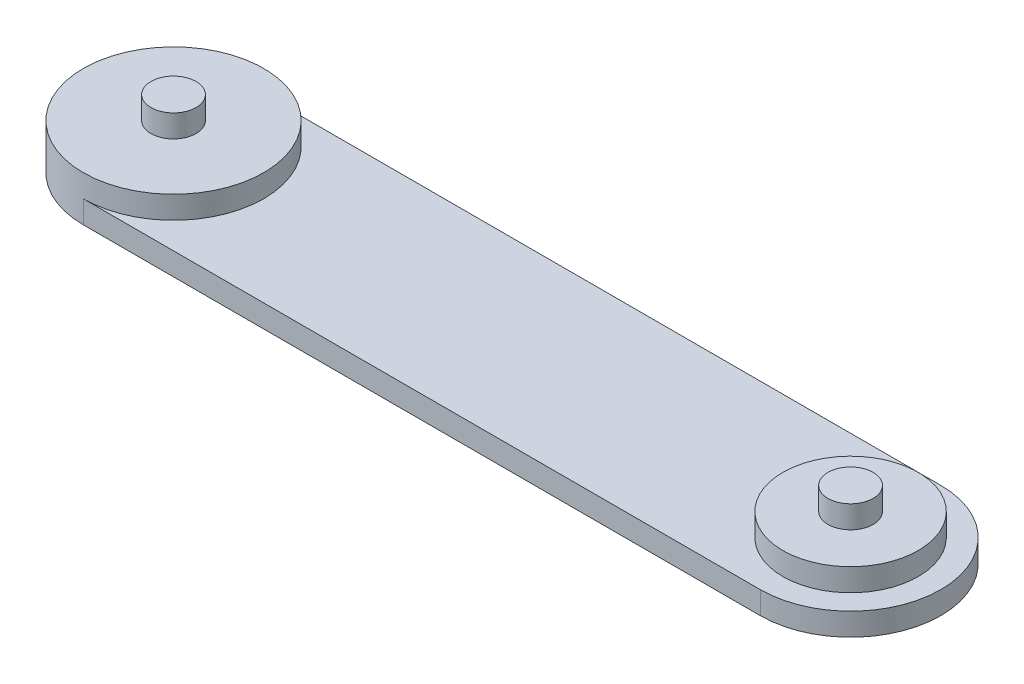
ISO-10303-21;
HEADER;
FILE_DESCRIPTION(('STEP AP214'),'2;1');
FILE_NAME('part.step','',(''),(''),'','','');
FILE_SCHEMA(('AUTOMOTIVE_DESIGN { 1 0 10303 214 1 1 1 1 }'));
ENDSEC;
DATA;
#1=APPLICATION_CONTEXT('core data for automotive mechanical design processes');
#2=APPLICATION_PROTOCOL_DEFINITION('international standard','automotive_design',2000,#1);
#3=PRODUCT_CONTEXT('',#1,'mechanical');
#4=PRODUCT('Part','Part','',(#3));
#5=PRODUCT_RELATED_PRODUCT_CATEGORY('part','',(#4));
#6=PRODUCT_DEFINITION_FORMATION('','',#4);
#7=PRODUCT_DEFINITION_CONTEXT('part definition',#1,'design');
#8=PRODUCT_DEFINITION('design','',#6,#7);
#9=PRODUCT_DEFINITION_SHAPE('','',#8);
#10=(LENGTH_UNIT() NAMED_UNIT(*) SI_UNIT(.MILLI.,.METRE.));
#11=(NAMED_UNIT(*) PLANE_ANGLE_UNIT() SI_UNIT($,.RADIAN.));
#12=(NAMED_UNIT(*) SI_UNIT($,.STERADIAN.) SOLID_ANGLE_UNIT());
#13=UNCERTAINTY_MEASURE_WITH_UNIT(LENGTH_MEASURE(1.E-05),#10,'distance_accuracy_value','');
#14=(GEOMETRIC_REPRESENTATION_CONTEXT(3) GLOBAL_UNCERTAINTY_ASSIGNED_CONTEXT((#13)) GLOBAL_UNIT_ASSIGNED_CONTEXT((#10,
#11,#12)) REPRESENTATION_CONTEXT('',''));
#15=CARTESIAN_POINT('',(0.,0.,0.));
#16=DIRECTION('',(0.,0.,1.));
#17=DIRECTION('',(1.,0.,0.));
#18=AXIS2_PLACEMENT_3D('',#15,#16,#17);
#19=CARTESIAN_POINT('',(-300.,10.,0.));
#20=DIRECTION('',(0.,-1.,0.));
#21=DIRECTION('',(0.,0.,-1.));
#22=AXIS2_PLACEMENT_3D('',#19,#20,#21);
#23=CYLINDRICAL_SURFACE('',#22,40.);
#24=CARTESIAN_POINT('',(-300.,0.,0.));
#25=DIRECTION('',(0.,1.,0.));
#26=DIRECTION('',(0.,0.,1.));
#27=AXIS2_PLACEMENT_3D('',#24,#25,#26);
#28=CIRCLE('',#27,40.);
#29=CARTESIAN_POINT('',(-300.,0.,-40.));
#30=VERTEX_POINT('',#29);
#31=CARTESIAN_POINT('',(-300.,0.,40.));
#32=VERTEX_POINT('',#31);
#33=EDGE_CURVE('E192',#30,#32,#28,.T.);
#34=ORIENTED_EDGE('',*,*,#33,.T.);
#35=DIRECTION('',(0.,-1.,0.));
#36=VECTOR('',#35,1.);
#37=CARTESIAN_POINT('',(-300.,10.,40.));
#38=LINE('',#37,#36);
#39=CARTESIAN_POINT('',(-300.,10.,40.));
#40=VERTEX_POINT('',#39);
#41=EDGE_CURVE('E45',#40,#32,#38,.T.);
#42=ORIENTED_EDGE('',*,*,#41,.F.);
#43=CARTESIAN_POINT('',(-300.,10.,0.));
#44=DIRECTION('',(0.,1.,0.));
#45=DIRECTION('',(0.,0.,1.));
#46=AXIS2_PLACEMENT_3D('',#43,#44,#45);
#47=CIRCLE('',#46,40.);
#48=CARTESIAN_POINT('',(-300.,10.,-40.));
#49=VERTEX_POINT('',#48);
#50=EDGE_CURVE('E184',#40,#49,#47,.T.);
#51=ORIENTED_EDGE('',*,*,#50,.T.);
#52=DIRECTION('',(0.,-1.,0.));
#53=VECTOR('',#52,1.);
#54=CARTESIAN_POINT('',(-300.,10.,-40.));
#55=LINE('',#54,#53);
#56=EDGE_CURVE('E203',#49,#30,#55,.T.);
#57=ORIENTED_EDGE('',*,*,#56,.T.);
#58=EDGE_LOOP('',(#34,#42,#51,#57));
#59=FACE_BOUND('',#58,.T.);
#60=CARTESIAN_POINT('',(-300.,20.,0.));
#61=DIRECTION('',(0.,1.,0.));
#62=DIRECTION('',(0.,0.,1.));
#63=AXIS2_PLACEMENT_3D('',#60,#61,#62);
#64=CIRCLE('',#63,40.);
#65=CARTESIAN_POINT('',(-300.,20.,40.));
#66=VERTEX_POINT('',#65);
#67=EDGE_CURVE('E188',#66,#66,#64,.T.);
#68=ORIENTED_EDGE('',*,*,#67,.F.);
#69=EDGE_LOOP('',(#68));
#70=FACE_BOUND('',#69,.T.);
#71=ADVANCED_FACE('F42',(#59,#70),#23,.T.);
#72=CARTESIAN_POINT('',(-300.,10.,40.));
#73=DIRECTION('',(0.,0.,-1.));
#74=DIRECTION('',(-1.,0.,0.));
#75=AXIS2_PLACEMENT_3D('',#72,#73,#74);
#76=PLANE('',#75);
#77=DIRECTION('',(1.,0.,0.));
#78=VECTOR('',#77,1.);
#79=CARTESIAN_POINT('',(-300.,0.,40.));
#80=LINE('',#79,#78);
#81=CARTESIAN_POINT('',(0.,0.,40.));
#82=VERTEX_POINT('',#81);
#83=EDGE_CURVE('E207',#32,#82,#80,.T.);
#84=ORIENTED_EDGE('',*,*,#83,.T.);
#85=DIRECTION('',(0.,-1.,0.));
#86=VECTOR('',#85,1.);
#87=CARTESIAN_POINT('',(0.,10.,40.));
#88=LINE('',#87,#86);
#89=CARTESIAN_POINT('',(0.,10.,40.));
#90=VERTEX_POINT('',#89);
#91=EDGE_CURVE('E219',#90,#82,#88,.T.);
#92=ORIENTED_EDGE('',*,*,#91,.F.);
#93=DIRECTION('',(1.,0.,0.));
#94=VECTOR('',#93,1.);
#95=CARTESIAN_POINT('',(-300.,10.,40.));
#96=LINE('',#95,#94);
#97=EDGE_CURVE('E92',#40,#90,#96,.T.);
#98=ORIENTED_EDGE('',*,*,#97,.F.);
#99=ORIENTED_EDGE('',*,*,#41,.T.);
#100=EDGE_LOOP('',(#84,#92,#98,#99));
#101=FACE_BOUND('',#100,.T.);
#102=ADVANCED_FACE('F228',(#101),#76,.F.);
#103=CARTESIAN_POINT('',(0.,10.,0.));
#104=DIRECTION('',(0.,-1.,0.));
#105=DIRECTION('',(0.,0.,-1.));
#106=AXIS2_PLACEMENT_3D('',#103,#104,#105);
#107=CYLINDRICAL_SURFACE('',#106,40.);
#108=CARTESIAN_POINT('',(0.,0.,0.));
#109=DIRECTION('',(0.,1.,0.));
#110=DIRECTION('',(0.,0.,1.));
#111=AXIS2_PLACEMENT_3D('',#108,#109,#110);
#112=CIRCLE('',#111,40.);
#113=CARTESIAN_POINT('',(0.,0.,-40.));
#114=VERTEX_POINT('',#113);
#115=EDGE_CURVE('E210',#82,#114,#112,.T.);
#116=ORIENTED_EDGE('',*,*,#115,.T.);
#117=DIRECTION('',(0.,-1.,0.));
#118=VECTOR('',#117,1.);
#119=CARTESIAN_POINT('',(0.,10.,-40.));
#120=LINE('',#119,#118);
#121=CARTESIAN_POINT('',(0.,10.,-40.));
#122=VERTEX_POINT('',#121);
#123=EDGE_CURVE('E217',#122,#114,#120,.T.);
#124=ORIENTED_EDGE('',*,*,#123,.F.);
#125=CARTESIAN_POINT('',(0.,10.,0.));
#126=DIRECTION('',(0.,1.,0.));
#127=DIRECTION('',(0.,0.,1.));
#128=AXIS2_PLACEMENT_3D('',#125,#126,#127);
#129=CIRCLE('',#128,40.);
#130=EDGE_CURVE('E198',#90,#122,#129,.T.);
#131=ORIENTED_EDGE('',*,*,#130,.F.);
#132=ORIENTED_EDGE('',*,*,#91,.T.);
#133=EDGE_LOOP('',(#116,#124,#131,#132));
#134=FACE_BOUND('',#133,.T.);
#135=ADVANCED_FACE('F235',(#134),#107,.T.);
#136=CARTESIAN_POINT('',(-300.,10.,-40.));
#137=DIRECTION('',(0.,0.,1.));
#138=DIRECTION('',(1.,0.,0.));
#139=AXIS2_PLACEMENT_3D('',#136,#137,#138);
#140=PLANE('',#139);
#141=DIRECTION('',(-1.,0.,0.));
#142=VECTOR('',#141,1.);
#143=CARTESIAN_POINT('',(-300.,0.,-40.));
#144=LINE('',#143,#142);
#145=EDGE_CURVE('E88',#114,#30,#144,.T.);
#146=ORIENTED_EDGE('',*,*,#145,.T.);
#147=ORIENTED_EDGE('',*,*,#56,.F.);
#148=DIRECTION('',(-1.,0.,0.));
#149=VECTOR('',#148,1.);
#150=CARTESIAN_POINT('',(-300.,10.,-40.));
#151=LINE('',#150,#149);
#152=EDGE_CURVE('E68',#122,#49,#151,.T.);
#153=ORIENTED_EDGE('',*,*,#152,.F.);
#154=ORIENTED_EDGE('',*,*,#123,.T.);
#155=EDGE_LOOP('',(#146,#147,#153,#154));
#156=FACE_BOUND('',#155,.T.);
#157=ADVANCED_FACE('F236',(#156),#140,.F.);
#158=CARTESIAN_POINT('',(-300.,10.,0.));
#159=DIRECTION('',(0.,1.,0.));
#160=DIRECTION('',(0.,0.,1.));
#161=AXIS2_PLACEMENT_3D('',#158,#159,#160);
#162=PLANE('',#161);
#163=CARTESIAN_POINT('',(0.,10.,0.));
#164=DIRECTION('',(0.,1.,0.));
#165=DIRECTION('',(0.,0.,1.));
#166=AXIS2_PLACEMENT_3D('',#163,#164,#165);
#167=CIRCLE('',#166,30.);
#168=CARTESIAN_POINT('',(0.,10.,30.));
#169=VERTEX_POINT('',#168);
#170=EDGE_CURVE('E180',#169,#169,#167,.T.);
#171=ORIENTED_EDGE('',*,*,#170,.F.);
#172=EDGE_LOOP('',(#171));
#173=FACE_BOUND('',#172,.T.);
#174=ORIENTED_EDGE('',*,*,#50,.F.);
#175=ORIENTED_EDGE('',*,*,#97,.T.);
#176=ORIENTED_EDGE('',*,*,#130,.T.);
#177=ORIENTED_EDGE('',*,*,#152,.T.);
#178=EDGE_LOOP('',(#174,#175,#176,#177));
#179=FACE_BOUND('',#178,.T.);
#180=ADVANCED_FACE('F237',(#173,#179),#162,.T.);
#181=CARTESIAN_POINT('',(-300.,0.,0.));
#182=DIRECTION('',(0.,1.,0.));
#183=DIRECTION('',(0.,0.,1.));
#184=AXIS2_PLACEMENT_3D('',#181,#182,#183);
#185=PLANE('',#184);
#186=DIRECTION('',(1.,0.,0.));
#187=VECTOR('',#186,1.);
#188=CARTESIAN_POINT('',(-300.,0.,-25.));
#189=LINE('',#188,#187);
#190=CARTESIAN_POINT('',(-300.,0.,-25.));
#191=VERTEX_POINT('',#190);
#192=CARTESIAN_POINT('',(0.,0.,-25.));
#193=VERTEX_POINT('',#192);
#194=EDGE_CURVE('E154',#191,#193,#189,.T.);
#195=ORIENTED_EDGE('',*,*,#194,.F.);
#196=CARTESIAN_POINT('',(-300.,0.,0.));
#197=DIRECTION('',(0.,-1.,0.));
#198=DIRECTION('',(0.,0.,-1.));
#199=AXIS2_PLACEMENT_3D('',#196,#197,#198);
#200=CIRCLE('',#199,25.);
#201=CARTESIAN_POINT('',(-300.,0.,25.));
#202=VERTEX_POINT('',#201);
#203=EDGE_CURVE('E59',#202,#191,#200,.T.);
#204=ORIENTED_EDGE('',*,*,#203,.F.);
#205=DIRECTION('',(-1.,0.,0.));
#206=VECTOR('',#205,1.);
#207=CARTESIAN_POINT('',(-300.,0.,25.));
#208=LINE('',#207,#206);
#209=CARTESIAN_POINT('',(0.,0.,25.));
#210=VERTEX_POINT('',#209);
#211=EDGE_CURVE('E141',#210,#202,#208,.T.);
#212=ORIENTED_EDGE('',*,*,#211,.F.);
#213=CARTESIAN_POINT('',(0.,0.,0.));
#214=DIRECTION('',(0.,-1.,0.));
#215=DIRECTION('',(0.,0.,-1.));
#216=AXIS2_PLACEMENT_3D('',#213,#214,#215);
#217=CIRCLE('',#216,25.);
#218=EDGE_CURVE('E145',#193,#210,#217,.T.);
#219=ORIENTED_EDGE('',*,*,#218,.F.);
#220=EDGE_LOOP('',(#195,#204,#212,#219));
#221=FACE_BOUND('',#220,.T.);
#222=ORIENTED_EDGE('',*,*,#33,.F.);
#223=ORIENTED_EDGE('',*,*,#145,.F.);
#224=ORIENTED_EDGE('',*,*,#115,.F.);
#225=ORIENTED_EDGE('',*,*,#83,.F.);
#226=EDGE_LOOP('',(#222,#223,#224,#225));
#227=FACE_BOUND('',#226,.T.);
#228=ADVANCED_FACE('F233',(#221,#227),#185,.F.);
#229=CARTESIAN_POINT('',(-300.,20.,0.));
#230=DIRECTION('',(0.,1.,0.));
#231=DIRECTION('',(0.,0.,1.));
#232=AXIS2_PLACEMENT_3D('',#229,#230,#231);
#233=PLANE('',#232);
#234=CARTESIAN_POINT('',(-300.,20.,0.));
#235=DIRECTION('',(0.,1.,0.));
#236=DIRECTION('',(0.,0.,1.));
#237=AXIS2_PLACEMENT_3D('',#234,#235,#236);
#238=CIRCLE('',#237,10.);
#239=CARTESIAN_POINT('',(-300.,20.,10.));
#240=VERTEX_POINT('',#239);
#241=EDGE_CURVE('E11',#240,#240,#238,.T.);
#242=ORIENTED_EDGE('',*,*,#241,.F.);
#243=EDGE_LOOP('',(#242));
#244=FACE_BOUND('',#243,.T.);
#245=ORIENTED_EDGE('',*,*,#67,.T.);
#246=EDGE_LOOP('',(#245));
#247=FACE_BOUND('',#246,.T.);
#248=ADVANCED_FACE('F246',(#244,#247),#233,.T.);
#249=CARTESIAN_POINT('',(0.,20.,0.));
#250=DIRECTION('',(0.,-1.,0.));
#251=DIRECTION('',(0.,0.,-1.));
#252=AXIS2_PLACEMENT_3D('',#249,#250,#251);
#253=CYLINDRICAL_SURFACE('',#252,30.);
#254=CARTESIAN_POINT('',(0.,20.,0.));
#255=DIRECTION('',(0.,1.,0.));
#256=DIRECTION('',(0.,0.,1.));
#257=AXIS2_PLACEMENT_3D('',#254,#255,#256);
#258=CIRCLE('',#257,30.);
#259=CARTESIAN_POINT('',(0.,20.,30.));
#260=VERTEX_POINT('',#259);
#261=EDGE_CURVE('E176',#260,#260,#258,.T.);
#262=ORIENTED_EDGE('',*,*,#261,.F.);
#263=EDGE_LOOP('',(#262));
#264=FACE_BOUND('',#263,.T.);
#265=ORIENTED_EDGE('',*,*,#170,.T.);
#266=EDGE_LOOP('',(#265));
#267=FACE_BOUND('',#266,.T.);
#268=ADVANCED_FACE('F280',(#264,#267),#253,.T.);
#269=CARTESIAN_POINT('',(0.,20.,0.));
#270=DIRECTION('',(0.,1.,0.));
#271=DIRECTION('',(0.,0.,1.));
#272=AXIS2_PLACEMENT_3D('',#269,#270,#271);
#273=PLANE('',#272);
#274=CARTESIAN_POINT('',(0.,20.,0.));
#275=DIRECTION('',(0.,1.,0.));
#276=DIRECTION('',(0.,0.,1.));
#277=AXIS2_PLACEMENT_3D('',#274,#275,#276);
#278=CIRCLE('',#277,10.);
#279=CARTESIAN_POINT('',(0.,20.,10.));
#280=VERTEX_POINT('',#279);
#281=EDGE_CURVE('E51',#280,#280,#278,.T.);
#282=ORIENTED_EDGE('',*,*,#281,.F.);
#283=EDGE_LOOP('',(#282));
#284=FACE_BOUND('',#283,.T.);
#285=ORIENTED_EDGE('',*,*,#261,.T.);
#286=EDGE_LOOP('',(#285));
#287=FACE_BOUND('',#286,.T.);
#288=ADVANCED_FACE('F285',(#284,#287),#273,.T.);
#289=CARTESIAN_POINT('',(0.,30.,0.));
#290=DIRECTION('',(0.,-1.,0.));
#291=DIRECTION('',(0.,0.,-1.));
#292=AXIS2_PLACEMENT_3D('',#289,#290,#291);
#293=CYLINDRICAL_SURFACE('',#292,10.);
#294=CARTESIAN_POINT('',(0.,30.,0.));
#295=DIRECTION('',(0.,1.,0.));
#296=DIRECTION('',(0.,0.,1.));
#297=AXIS2_PLACEMENT_3D('',#294,#295,#296);
#298=CIRCLE('',#297,10.);
#299=CARTESIAN_POINT('',(0.,30.,10.));
#300=VERTEX_POINT('',#299);
#301=EDGE_CURVE('E172',#300,#300,#298,.T.);
#302=ORIENTED_EDGE('',*,*,#301,.F.);
#303=EDGE_LOOP('',(#302));
#304=FACE_BOUND('',#303,.T.);
#305=ORIENTED_EDGE('',*,*,#281,.T.);
#306=EDGE_LOOP('',(#305));
#307=FACE_BOUND('',#306,.T.);
#308=ADVANCED_FACE('F305',(#304,#307),#293,.T.);
#309=CARTESIAN_POINT('',(0.,30.,0.));
#310=DIRECTION('',(0.,1.,0.));
#311=DIRECTION('',(0.,0.,1.));
#312=AXIS2_PLACEMENT_3D('',#309,#310,#311);
#313=PLANE('',#312);
#314=ORIENTED_EDGE('',*,*,#301,.T.);
#315=EDGE_LOOP('',(#314));
#316=FACE_BOUND('',#315,.T.);
#317=ADVANCED_FACE('F316',(#316),#313,.T.);
#318=CARTESIAN_POINT('',(-300.,30.,0.));
#319=DIRECTION('',(0.,-1.,0.));
#320=DIRECTION('',(0.,0.,-1.));
#321=AXIS2_PLACEMENT_3D('',#318,#319,#320);
#322=CYLINDRICAL_SURFACE('',#321,10.);
#323=CARTESIAN_POINT('',(-300.,30.,0.));
#324=DIRECTION('',(0.,1.,0.));
#325=DIRECTION('',(0.,0.,1.));
#326=AXIS2_PLACEMENT_3D('',#323,#324,#325);
#327=CIRCLE('',#326,10.);
#328=CARTESIAN_POINT('',(-300.,30.,10.));
#329=VERTEX_POINT('',#328);
#330=EDGE_CURVE('E163',#329,#329,#327,.T.);
#331=ORIENTED_EDGE('',*,*,#330,.F.);
#332=EDGE_LOOP('',(#331));
#333=FACE_BOUND('',#332,.T.);
#334=ORIENTED_EDGE('',*,*,#241,.T.);
#335=EDGE_LOOP('',(#334));
#336=FACE_BOUND('',#335,.T.);
#337=ADVANCED_FACE('F327',(#333,#336),#322,.T.);
#338=CARTESIAN_POINT('',(-300.,30.,0.));
#339=DIRECTION('',(0.,1.,0.));
#340=DIRECTION('',(0.,0.,1.));
#341=AXIS2_PLACEMENT_3D('',#338,#339,#340);
#342=PLANE('',#341);
#343=ORIENTED_EDGE('',*,*,#330,.T.);
#344=EDGE_LOOP('',(#343));
#345=FACE_BOUND('',#344,.T.);
#346=ADVANCED_FACE('F338',(#345),#342,.T.);
#347=CARTESIAN_POINT('',(-300.,2.,0.));
#348=DIRECTION('',(0.,-1.,0.));
#349=DIRECTION('',(0.,0.,-1.));
#350=AXIS2_PLACEMENT_3D('',#347,#348,#349);
#351=CYLINDRICAL_SURFACE('',#350,25.);
#352=ORIENTED_EDGE('',*,*,#203,.T.);
#353=DIRECTION('',(0.,-1.,0.));
#354=VECTOR('',#353,1.);
#355=CARTESIAN_POINT('',(-300.,2.,-25.));
#356=LINE('',#355,#354);
#357=CARTESIAN_POINT('',(-300.,2.,-25.));
#358=VERTEX_POINT('',#357);
#359=EDGE_CURVE('E116',#358,#191,#356,.T.);
#360=ORIENTED_EDGE('',*,*,#359,.F.);
#361=CARTESIAN_POINT('',(-300.,2.,0.));
#362=DIRECTION('',(0.,-1.,0.));
#363=DIRECTION('',(0.,0.,-1.));
#364=AXIS2_PLACEMENT_3D('',#361,#362,#363);
#365=CIRCLE('',#364,25.);
#366=CARTESIAN_POINT('',(-300.,2.,25.));
#367=VERTEX_POINT('',#366);
#368=EDGE_CURVE('E120',#367,#358,#365,.T.);
#369=ORIENTED_EDGE('',*,*,#368,.F.);
#370=DIRECTION('',(0.,-1.,0.));
#371=VECTOR('',#370,1.);
#372=CARTESIAN_POINT('',(-300.,2.,25.));
#373=LINE('',#372,#371);
#374=EDGE_CURVE('E160',#367,#202,#373,.T.);
#375=ORIENTED_EDGE('',*,*,#374,.T.);
#376=EDGE_LOOP('',(#352,#360,#369,#375));
#377=FACE_BOUND('',#376,.T.);
#378=ADVANCED_FACE('F118',(#377),#351,.F.);
#379=CARTESIAN_POINT('',(-300.,2.,25.));
#380=DIRECTION('',(0.,0.,1.));
#381=DIRECTION('',(1.,0.,0.));
#382=AXIS2_PLACEMENT_3D('',#379,#380,#381);
#383=PLANE('',#382);
#384=ORIENTED_EDGE('',*,*,#211,.T.);
#385=ORIENTED_EDGE('',*,*,#374,.F.);
#386=DIRECTION('',(-1.,0.,0.));
#387=VECTOR('',#386,1.);
#388=CARTESIAN_POINT('',(-300.,2.,25.));
#389=LINE('',#388,#387);
#390=CARTESIAN_POINT('',(0.,2.,25.));
#391=VERTEX_POINT('',#390);
#392=EDGE_CURVE('E127',#391,#367,#389,.T.);
#393=ORIENTED_EDGE('',*,*,#392,.F.);
#394=DIRECTION('',(0.,-1.,0.));
#395=VECTOR('',#394,1.);
#396=CARTESIAN_POINT('',(0.,2.,25.));
#397=LINE('',#396,#395);
#398=EDGE_CURVE('E164',#391,#210,#397,.T.);
#399=ORIENTED_EDGE('',*,*,#398,.T.);
#400=EDGE_LOOP('',(#384,#385,#393,#399));
#401=FACE_BOUND('',#400,.T.);
#402=ADVANCED_FACE('F361',(#401),#383,.F.);
#403=CARTESIAN_POINT('',(0.,2.,0.));
#404=DIRECTION('',(0.,-1.,0.));
#405=DIRECTION('',(0.,0.,-1.));
#406=AXIS2_PLACEMENT_3D('',#403,#404,#405);
#407=CYLINDRICAL_SURFACE('',#406,25.);
#408=ORIENTED_EDGE('',*,*,#218,.T.);
#409=ORIENTED_EDGE('',*,*,#398,.F.);
#410=CARTESIAN_POINT('',(0.,2.,0.));
#411=DIRECTION('',(0.,-1.,0.));
#412=DIRECTION('',(0.,0.,-1.));
#413=AXIS2_PLACEMENT_3D('',#410,#411,#412);
#414=CIRCLE('',#413,25.);
#415=CARTESIAN_POINT('',(0.,2.,-25.));
#416=VERTEX_POINT('',#415);
#417=EDGE_CURVE('E136',#416,#391,#414,.T.);
#418=ORIENTED_EDGE('',*,*,#417,.F.);
#419=DIRECTION('',(0.,-1.,0.));
#420=VECTOR('',#419,1.);
#421=CARTESIAN_POINT('',(0.,2.,-25.));
#422=LINE('',#421,#420);
#423=EDGE_CURVE('E126',#416,#193,#422,.T.);
#424=ORIENTED_EDGE('',*,*,#423,.T.);
#425=EDGE_LOOP('',(#408,#409,#418,#424));
#426=FACE_BOUND('',#425,.T.);
#427=ADVANCED_FACE('F371',(#426),#407,.F.);
#428=CARTESIAN_POINT('',(-300.,2.,-25.));
#429=DIRECTION('',(0.,0.,-1.));
#430=DIRECTION('',(-1.,0.,0.));
#431=AXIS2_PLACEMENT_3D('',#428,#429,#430);
#432=PLANE('',#431);
#433=ORIENTED_EDGE('',*,*,#194,.T.);
#434=ORIENTED_EDGE('',*,*,#423,.F.);
#435=DIRECTION('',(1.,0.,0.));
#436=VECTOR('',#435,1.);
#437=CARTESIAN_POINT('',(-300.,2.,-25.));
#438=LINE('',#437,#436);
#439=EDGE_CURVE('E130',#358,#416,#438,.T.);
#440=ORIENTED_EDGE('',*,*,#439,.F.);
#441=ORIENTED_EDGE('',*,*,#359,.T.);
#442=EDGE_LOOP('',(#433,#434,#440,#441));
#443=FACE_BOUND('',#442,.T.);
#444=ADVANCED_FACE('F131',(#443),#432,.F.);
#445=CARTESIAN_POINT('',(-300.,2.,0.));
#446=DIRECTION('',(0.,-1.,0.));
#447=DIRECTION('',(0.,0.,-1.));
#448=AXIS2_PLACEMENT_3D('',#445,#446,#447);
#449=PLANE('',#448);
#450=ORIENTED_EDGE('',*,*,#368,.T.);
#451=ORIENTED_EDGE('',*,*,#439,.T.);
#452=ORIENTED_EDGE('',*,*,#417,.T.);
#453=ORIENTED_EDGE('',*,*,#392,.T.);
#454=EDGE_LOOP('',(#450,#451,#452,#453));
#455=FACE_BOUND('',#454,.T.);
#456=ADVANCED_FACE('F138',(#455),#449,.T.);
#457=CLOSED_SHELL('',(#71,#102,#135,#157,#180,#228,#248,#268,#288,#308,#317,#337,#346,#378,#402,
#427,#444,#456));
#458=MANIFOLD_SOLID_BREP('B2',#457);
#459=ADVANCED_BREP_SHAPE_REPRESENTATION('',(#18,#458),#14);
#460=SHAPE_DEFINITION_REPRESENTATION(#9,#459);
ENDSEC;
END-ISO-10303-21;
